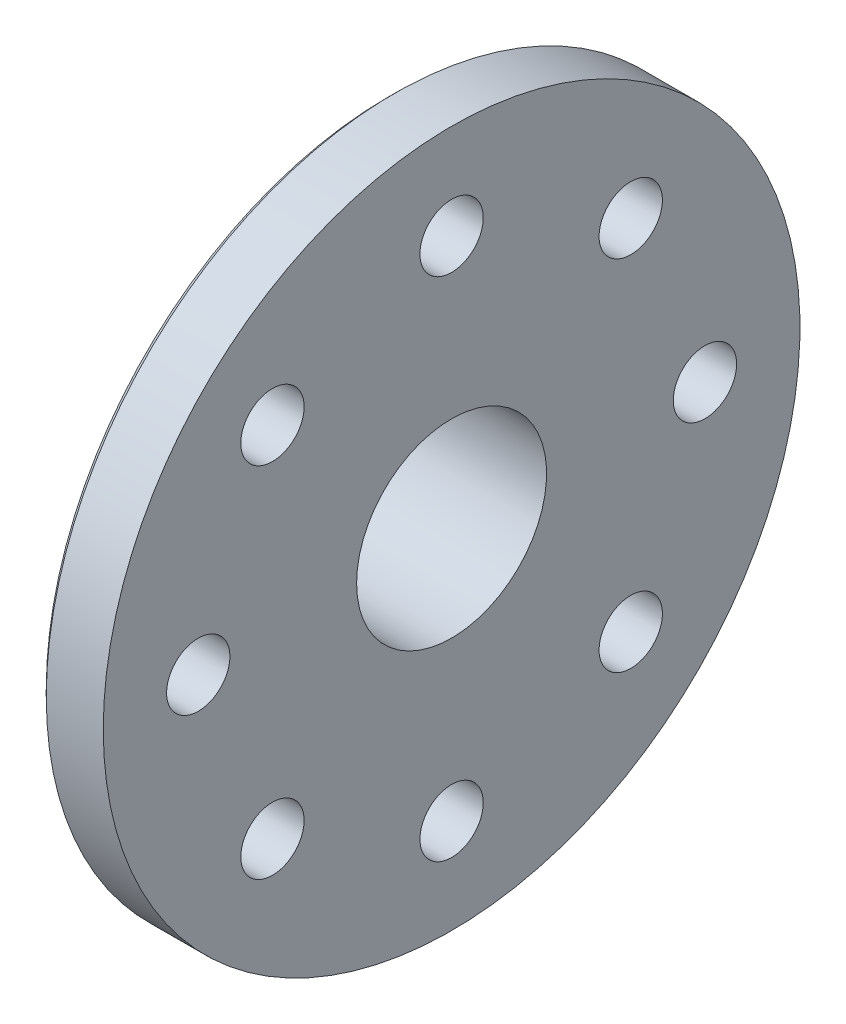
ISO-10303-21;
HEADER;
FILE_DESCRIPTION(('STEP AP214'),'2;1');
FILE_NAME('part.step','',(''),(''),'','','');
FILE_SCHEMA(('AUTOMOTIVE_DESIGN { 1 0 10303 214 1 1 1 1 }'));
ENDSEC;
DATA;
#1=APPLICATION_CONTEXT('core data for automotive mechanical design processes');
#2=APPLICATION_PROTOCOL_DEFINITION('international standard','automotive_design',2000,#1);
#3=PRODUCT_CONTEXT('',#1,'mechanical');
#4=PRODUCT('Part','Part','',(#3));
#5=PRODUCT_RELATED_PRODUCT_CATEGORY('part','',(#4));
#6=PRODUCT_DEFINITION_FORMATION('','',#4);
#7=PRODUCT_DEFINITION_CONTEXT('part definition',#1,'design');
#8=PRODUCT_DEFINITION('design','',#6,#7);
#9=PRODUCT_DEFINITION_SHAPE('','',#8);
#10=(LENGTH_UNIT() NAMED_UNIT(*) SI_UNIT(.MILLI.,.METRE.));
#11=(NAMED_UNIT(*) PLANE_ANGLE_UNIT() SI_UNIT($,.RADIAN.));
#12=(NAMED_UNIT(*) SI_UNIT($,.STERADIAN.) SOLID_ANGLE_UNIT());
#13=UNCERTAINTY_MEASURE_WITH_UNIT(LENGTH_MEASURE(1.E-05),#10,'distance_accuracy_value','');
#14=(GEOMETRIC_REPRESENTATION_CONTEXT(3) GLOBAL_UNCERTAINTY_ASSIGNED_CONTEXT((#13)) GLOBAL_UNIT_ASSIGNED_CONTEXT((#10,
#11,#12)) REPRESENTATION_CONTEXT('',''));
#15=CARTESIAN_POINT('',(0.,0.,0.));
#16=DIRECTION('',(0.,0.,1.));
#17=DIRECTION('',(1.,0.,0.));
#18=AXIS2_PLACEMENT_3D('',#15,#16,#17);
#19=CARTESIAN_POINT('',(1.,3.,0.));
#20=DIRECTION('',(-1.,0.,0.));
#21=DIRECTION('',(0.,0.,1.));
#22=AXIS2_PLACEMENT_3D('',#19,#20,#21);
#23=PLANE('',#22);
#24=CARTESIAN_POINT('',(1.,5.65685424949245,5.65685424949231));
#25=DIRECTION('',(-1.,0.,0.));
#26=DIRECTION('',(0.,-0.707106781186539,0.707106781186556));
#27=AXIS2_PLACEMENT_3D('',#24,#25,#26);
#28=CIRCLE('',#27,1.);
#29=CARTESIAN_POINT('',(1.,4.94974746830591,6.36396103067887));
#30=VERTEX_POINT('',#29);
#31=EDGE_CURVE('E137',#30,#30,#28,.T.);
#32=ORIENTED_EDGE('',*,*,#31,.T.);
#33=EDGE_LOOP('',(#32));
#34=FACE_BOUND('',#33,.T.);
#35=CARTESIAN_POINT('',(1.,0.,8.));
#36=DIRECTION('',(-1.,0.,0.));
#37=DIRECTION('',(0.,-1.,0.));
#38=AXIS2_PLACEMENT_3D('',#35,#36,#37);
#39=CIRCLE('',#38,1.);
#40=CARTESIAN_POINT('',(1.,-0.999999999999917,8.00000000000001));
#41=VERTEX_POINT('',#40);
#42=EDGE_CURVE('E134',#41,#41,#39,.T.);
#43=ORIENTED_EDGE('',*,*,#42,.T.);
#44=EDGE_LOOP('',(#43));
#45=FACE_BOUND('',#44,.T.);
#46=CARTESIAN_POINT('',(1.,-5.65685424949233,5.65685424949243));
#47=DIRECTION('',(-1.,0.,0.));
#48=DIRECTION('',(0.,-0.707106781186554,-0.707106781186541));
#49=AXIS2_PLACEMENT_3D('',#46,#47,#48);
#50=CIRCLE('',#49,1.);
#51=CARTESIAN_POINT('',(1.,-6.36396103067888,4.94974746830589));
#52=VERTEX_POINT('',#51);
#53=EDGE_CURVE('E131',#52,#52,#50,.T.);
#54=ORIENTED_EDGE('',*,*,#53,.T.);
#55=EDGE_LOOP('',(#54));
#56=FACE_BOUND('',#55,.T.);
#57=CARTESIAN_POINT('',(1.,-8.,0.));
#58=DIRECTION('',(-1.,0.,0.));
#59=DIRECTION('',(0.,0.,-1.));
#60=AXIS2_PLACEMENT_3D('',#57,#58,#59);
#61=CIRCLE('',#60,1.);
#62=CARTESIAN_POINT('',(1.,-8.,-1.));
#63=VERTEX_POINT('',#62);
#64=EDGE_CURVE('E128',#63,#63,#61,.T.);
#65=ORIENTED_EDGE('',*,*,#64,.T.);
#66=EDGE_LOOP('',(#65));
#67=FACE_BOUND('',#66,.T.);
#68=CARTESIAN_POINT('',(1.,-5.65685424949241,-5.65685424949235));
#69=DIRECTION('',(-1.,0.,0.));
#70=DIRECTION('',(0.,0.707106781186544,-0.707106781186551));
#71=AXIS2_PLACEMENT_3D('',#68,#69,#70);
#72=CIRCLE('',#71,1.);
#73=CARTESIAN_POINT('',(1.,-4.94974746830587,-6.3639610306789));
#74=VERTEX_POINT('',#73);
#75=EDGE_CURVE('E125',#74,#74,#72,.T.);
#76=ORIENTED_EDGE('',*,*,#75,.T.);
#77=EDGE_LOOP('',(#76));
#78=FACE_BOUND('',#77,.T.);
#79=CARTESIAN_POINT('',(1.,0.,-8.));
#80=DIRECTION('',(-1.,0.,0.));
#81=DIRECTION('',(0.,1.,0.));
#82=AXIS2_PLACEMENT_3D('',#79,#80,#81);
#83=CIRCLE('',#82,1.);
#84=CARTESIAN_POINT('',(1.,0.999999999999972,-8.));
#85=VERTEX_POINT('',#84);
#86=EDGE_CURVE('E122',#85,#85,#83,.T.);
#87=ORIENTED_EDGE('',*,*,#86,.T.);
#88=EDGE_LOOP('',(#87));
#89=FACE_BOUND('',#88,.T.);
#90=CARTESIAN_POINT('',(1.,5.65685424949237,-5.65685424949239));
#91=DIRECTION('',(-1.,0.,0.));
#92=DIRECTION('',(0.,0.707106781186549,0.707106781186546));
#93=AXIS2_PLACEMENT_3D('',#90,#91,#92);
#94=CIRCLE('',#93,1.);
#95=CARTESIAN_POINT('',(1.,6.36396103067892,-4.94974746830584));
#96=VERTEX_POINT('',#95);
#97=EDGE_CURVE('E119',#96,#96,#94,.T.);
#98=ORIENTED_EDGE('',*,*,#97,.T.);
#99=EDGE_LOOP('',(#98));
#100=FACE_BOUND('',#99,.T.);
#101=CARTESIAN_POINT('',(1.,8.,0.));
#102=DIRECTION('',(-1.,0.,0.));
#103=DIRECTION('',(0.,0.,1.));
#104=AXIS2_PLACEMENT_3D('',#101,#102,#103);
#105=CIRCLE('',#104,1.);
#106=CARTESIAN_POINT('',(1.,8.,1.));
#107=VERTEX_POINT('',#106);
#108=EDGE_CURVE('E116',#107,#107,#105,.T.);
#109=ORIENTED_EDGE('',*,*,#108,.T.);
#110=EDGE_LOOP('',(#109));
#111=FACE_BOUND('',#110,.T.);
#112=CARTESIAN_POINT('',(1.,0.,0.));
#113=DIRECTION('',(-1.,0.,0.));
#114=DIRECTION('',(0.,0.,1.));
#115=AXIS2_PLACEMENT_3D('',#112,#113,#114);
#116=CIRCLE('',#115,11.);
#117=CARTESIAN_POINT('',(1.,0.,11.));
#118=VERTEX_POINT('',#117);
#119=EDGE_CURVE('E98',#118,#118,#116,.T.);
#120=ORIENTED_EDGE('',*,*,#119,.F.);
#121=EDGE_LOOP('',(#120));
#122=FACE_BOUND('',#121,.T.);
#123=CARTESIAN_POINT('',(1.,0.,0.));
#124=DIRECTION('',(-1.,0.,0.));
#125=DIRECTION('',(0.,0.,1.));
#126=AXIS2_PLACEMENT_3D('',#123,#124,#125);
#127=CIRCLE('',#126,3.);
#128=CARTESIAN_POINT('',(1.,0.,3.));
#129=VERTEX_POINT('',#128);
#130=EDGE_CURVE('E113',#129,#129,#127,.T.);
#131=ORIENTED_EDGE('',*,*,#130,.T.);
#132=EDGE_LOOP('',(#131));
#133=FACE_BOUND('',#132,.T.);
#134=ADVANCED_FACE('F30',(#34,#45,#56,#67,#78,#89,#100,#111,#122,#133),#23,.F.);
#135=CARTESIAN_POINT('',(0.,0.,0.));
#136=DIRECTION('',(-1.,0.,0.));
#137=DIRECTION('',(0.,0.,1.));
#138=AXIS2_PLACEMENT_3D('',#135,#136,#137);
#139=CYLINDRICAL_SURFACE('',#138,11.);
#140=CARTESIAN_POINT('',(-0.800000000000007,0.,0.));
#141=DIRECTION('',(1.,0.,0.));
#142=DIRECTION('',(0.,0.,-1.));
#143=AXIS2_PLACEMENT_3D('',#140,#141,#142);
#144=CIRCLE('',#143,11.);
#145=CARTESIAN_POINT('',(-0.800000000000007,0.,-11.));
#146=VERTEX_POINT('',#145);
#147=EDGE_CURVE('E56',#146,#146,#144,.T.);
#148=ORIENTED_EDGE('',*,*,#147,.T.);
#149=EDGE_LOOP('',(#148));
#150=FACE_BOUND('',#149,.T.);
#151=ORIENTED_EDGE('',*,*,#119,.T.);
#152=EDGE_LOOP('',(#151));
#153=FACE_BOUND('',#152,.T.);
#154=ADVANCED_FACE('F160',(#150,#153),#139,.T.);
#155=CARTESIAN_POINT('',(-0.999999999999999,11.,0.));
#156=DIRECTION('',(1.,0.,0.));
#157=DIRECTION('',(0.,0.,-1.));
#158=AXIS2_PLACEMENT_3D('',#155,#156,#157);
#159=PLANE('',#158);
#160=CARTESIAN_POINT('',(-0.999999999999999,-5.65685424949233,5.65685424949243));
#161=DIRECTION('',(1.,0.,0.));
#162=DIRECTION('',(0.,0.,-1.));
#163=AXIS2_PLACEMENT_3D('',#160,#161,#162);
#164=CIRCLE('',#163,1.2);
#165=CARTESIAN_POINT('',(-0.999999999999999,-5.65685424949233,4.45685424949243));
#166=VERTEX_POINT('',#165);
#167=EDGE_CURVE('E68',#166,#166,#164,.T.);
#168=ORIENTED_EDGE('',*,*,#167,.T.);
#169=EDGE_LOOP('',(#168));
#170=FACE_BOUND('',#169,.T.);
#171=CARTESIAN_POINT('',(-0.999999999999999,0.,8.));
#172=DIRECTION('',(1.,0.,0.));
#173=DIRECTION('',(0.,0.,-1.));
#174=AXIS2_PLACEMENT_3D('',#171,#172,#173);
#175=CIRCLE('',#174,1.2);
#176=CARTESIAN_POINT('',(-0.999999999999999,0.,6.8));
#177=VERTEX_POINT('',#176);
#178=EDGE_CURVE('E71',#177,#177,#175,.T.);
#179=ORIENTED_EDGE('',*,*,#178,.T.);
#180=EDGE_LOOP('',(#179));
#181=FACE_BOUND('',#180,.T.);
#182=CARTESIAN_POINT('',(-0.999999999999999,5.65685424949245,5.65685424949231));
#183=DIRECTION('',(1.,0.,0.));
#184=DIRECTION('',(0.,0.,-1.));
#185=AXIS2_PLACEMENT_3D('',#182,#183,#184);
#186=CIRCLE('',#185,1.2);
#187=CARTESIAN_POINT('',(-0.999999999999999,5.65685424949245,4.45685424949231));
#188=VERTEX_POINT('',#187);
#189=EDGE_CURVE('E74',#188,#188,#186,.T.);
#190=ORIENTED_EDGE('',*,*,#189,.T.);
#191=EDGE_LOOP('',(#190));
#192=FACE_BOUND('',#191,.T.);
#193=CARTESIAN_POINT('',(-0.999999999999999,8.,0.));
#194=DIRECTION('',(1.,0.,0.));
#195=DIRECTION('',(0.,0.,-1.));
#196=AXIS2_PLACEMENT_3D('',#193,#194,#195);
#197=CIRCLE('',#196,1.2);
#198=CARTESIAN_POINT('',(-0.999999999999999,8.,-1.2));
#199=VERTEX_POINT('',#198);
#200=EDGE_CURVE('E77',#199,#199,#197,.T.);
#201=ORIENTED_EDGE('',*,*,#200,.T.);
#202=EDGE_LOOP('',(#201));
#203=FACE_BOUND('',#202,.T.);
#204=CARTESIAN_POINT('',(-0.999999999999999,0.,0.));
#205=DIRECTION('',(1.,0.,0.));
#206=DIRECTION('',(0.,0.,-1.));
#207=AXIS2_PLACEMENT_3D('',#204,#205,#206);
#208=CIRCLE('',#207,10.8);
#209=CARTESIAN_POINT('',(-0.999999999999999,0.,-10.8));
#210=VERTEX_POINT('',#209);
#211=EDGE_CURVE('E80',#210,#210,#208,.F.);
#212=ORIENTED_EDGE('',*,*,#211,.T.);
#213=EDGE_LOOP('',(#212));
#214=FACE_BOUND('',#213,.T.);
#215=CARTESIAN_POINT('',(-0.999999999999999,-8.,0.));
#216=DIRECTION('',(1.,0.,0.));
#217=DIRECTION('',(0.,0.,-1.));
#218=AXIS2_PLACEMENT_3D('',#215,#216,#217);
#219=CIRCLE('',#218,1.2);
#220=CARTESIAN_POINT('',(-0.999999999999999,-8.,-1.2));
#221=VERTEX_POINT('',#220);
#222=EDGE_CURVE('E83',#221,#221,#219,.T.);
#223=ORIENTED_EDGE('',*,*,#222,.T.);
#224=EDGE_LOOP('',(#223));
#225=FACE_BOUND('',#224,.T.);
#226=CARTESIAN_POINT('',(-0.999999999999999,-5.65685424949241,-5.65685424949235));
#227=DIRECTION('',(1.,0.,0.));
#228=DIRECTION('',(0.,0.,-1.));
#229=AXIS2_PLACEMENT_3D('',#226,#227,#228);
#230=CIRCLE('',#229,1.2);
#231=CARTESIAN_POINT('',(-0.999999999999999,-5.65685424949241,-6.85685424949235));
#232=VERTEX_POINT('',#231);
#233=EDGE_CURVE('E86',#232,#232,#230,.T.);
#234=ORIENTED_EDGE('',*,*,#233,.T.);
#235=EDGE_LOOP('',(#234));
#236=FACE_BOUND('',#235,.T.);
#237=CARTESIAN_POINT('',(-0.999999999999999,0.,-8.));
#238=DIRECTION('',(1.,0.,0.));
#239=DIRECTION('',(0.,0.,-1.));
#240=AXIS2_PLACEMENT_3D('',#237,#238,#239);
#241=CIRCLE('',#240,1.2);
#242=CARTESIAN_POINT('',(-0.999999999999999,0.,-9.2));
#243=VERTEX_POINT('',#242);
#244=EDGE_CURVE('E89',#243,#243,#241,.T.);
#245=ORIENTED_EDGE('',*,*,#244,.T.);
#246=EDGE_LOOP('',(#245));
#247=FACE_BOUND('',#246,.T.);
#248=CARTESIAN_POINT('',(-0.999999999999999,5.65685424949237,-5.65685424949239));
#249=DIRECTION('',(1.,0.,0.));
#250=DIRECTION('',(0.,0.,-1.));
#251=AXIS2_PLACEMENT_3D('',#248,#249,#250);
#252=CIRCLE('',#251,1.2);
#253=CARTESIAN_POINT('',(-0.999999999999999,5.65685424949237,-6.85685424949239));
#254=VERTEX_POINT('',#253);
#255=EDGE_CURVE('E92',#254,#254,#252,.T.);
#256=ORIENTED_EDGE('',*,*,#255,.T.);
#257=EDGE_LOOP('',(#256));
#258=FACE_BOUND('',#257,.T.);
#259=CARTESIAN_POINT('',(-0.999999999999999,0.,0.));
#260=DIRECTION('',(-1.,0.,0.));
#261=DIRECTION('',(0.,0.,1.));
#262=AXIS2_PLACEMENT_3D('',#259,#260,#261);
#263=CIRCLE('',#262,3.75);
#264=CARTESIAN_POINT('',(-0.999999999999999,0.,3.75));
#265=VERTEX_POINT('',#264);
#266=EDGE_CURVE('E101',#265,#265,#263,.T.);
#267=ORIENTED_EDGE('',*,*,#266,.F.);
#268=EDGE_LOOP('',(#267));
#269=FACE_BOUND('',#268,.T.);
#270=ADVANCED_FACE('F165',(#170,#181,#192,#203,#214,#225,#236,#247,#258,#269),#159,.F.);
#271=CARTESIAN_POINT('',(0.,0.,0.));
#272=DIRECTION('',(-1.,0.,0.));
#273=DIRECTION('',(0.,0.,1.));
#274=AXIS2_PLACEMENT_3D('',#271,#272,#273);
#275=CYLINDRICAL_SURFACE('',#274,3.75);
#276=CARTESIAN_POINT('',(-3.79999999999999,0.,0.));
#277=DIRECTION('',(1.,0.,0.));
#278=DIRECTION('',(0.,0.,-1.));
#279=AXIS2_PLACEMENT_3D('',#276,#277,#278);
#280=CIRCLE('',#279,3.75);
#281=CARTESIAN_POINT('',(-3.79999999999999,0.,-3.75));
#282=VERTEX_POINT('',#281);
#283=EDGE_CURVE('E10',#282,#282,#280,.T.);
#284=ORIENTED_EDGE('',*,*,#283,.T.);
#285=EDGE_LOOP('',(#284));
#286=FACE_BOUND('',#285,.T.);
#287=ORIENTED_EDGE('',*,*,#266,.T.);
#288=EDGE_LOOP('',(#287));
#289=FACE_BOUND('',#288,.T.);
#290=ADVANCED_FACE('F242',(#286,#289),#275,.T.);
#291=CARTESIAN_POINT('',(-4.,3.75,0.));
#292=DIRECTION('',(1.,0.,0.));
#293=DIRECTION('',(0.,0.,-1.));
#294=AXIS2_PLACEMENT_3D('',#291,#292,#293);
#295=PLANE('',#294);
#296=CARTESIAN_POINT('',(-4.,0.,0.));
#297=DIRECTION('',(1.,0.,0.));
#298=DIRECTION('',(0.,0.,-1.));
#299=AXIS2_PLACEMENT_3D('',#296,#297,#298);
#300=CIRCLE('',#299,3.55);
#301=CARTESIAN_POINT('',(-4.,0.,-3.55));
#302=VERTEX_POINT('',#301);
#303=EDGE_CURVE('E37',#302,#302,#300,.F.);
#304=ORIENTED_EDGE('',*,*,#303,.T.);
#305=EDGE_LOOP('',(#304));
#306=FACE_BOUND('',#305,.T.);
#307=CARTESIAN_POINT('',(-4.,0.,0.));
#308=DIRECTION('',(-1.,0.,0.));
#309=DIRECTION('',(0.,0.,1.));
#310=AXIS2_PLACEMENT_3D('',#307,#308,#309);
#311=CIRCLE('',#310,1.5);
#312=CARTESIAN_POINT('',(-4.,0.,1.5));
#313=VERTEX_POINT('',#312);
#314=EDGE_CURVE('E104',#313,#313,#311,.T.);
#315=ORIENTED_EDGE('',*,*,#314,.F.);
#316=EDGE_LOOP('',(#315));
#317=FACE_BOUND('',#316,.T.);
#318=ADVANCED_FACE('F237',(#306,#317),#295,.F.);
#319=CARTESIAN_POINT('',(0.,0.,0.));
#320=DIRECTION('',(-1.,0.,0.));
#321=DIRECTION('',(0.,0.,1.));
#322=AXIS2_PLACEMENT_3D('',#319,#320,#321);
#323=CYLINDRICAL_SURFACE('',#322,1.5);
#324=CARTESIAN_POINT('',(-3.5,0.,0.));
#325=DIRECTION('',(-1.,0.,0.));
#326=DIRECTION('',(0.,0.,1.));
#327=AXIS2_PLACEMENT_3D('',#324,#325,#326);
#328=CIRCLE('',#327,1.5);
#329=CARTESIAN_POINT('',(-3.5,0.,1.5));
#330=VERTEX_POINT('',#329);
#331=EDGE_CURVE('E107',#330,#330,#328,.T.);
#332=ORIENTED_EDGE('',*,*,#331,.F.);
#333=EDGE_LOOP('',(#332));
#334=FACE_BOUND('',#333,.T.);
#335=ORIENTED_EDGE('',*,*,#314,.T.);
#336=EDGE_LOOP('',(#335));
#337=FACE_BOUND('',#336,.T.);
#338=ADVANCED_FACE('F231',(#334,#337),#323,.F.);
#339=CARTESIAN_POINT('',(-3.5,3.,0.));
#340=DIRECTION('',(-1.,0.,0.));
#341=DIRECTION('',(0.,0.,1.));
#342=AXIS2_PLACEMENT_3D('',#339,#340,#341);
#343=PLANE('',#342);
#344=CARTESIAN_POINT('',(-3.5,0.,0.));
#345=DIRECTION('',(-1.,0.,0.));
#346=DIRECTION('',(0.,0.,1.));
#347=AXIS2_PLACEMENT_3D('',#344,#345,#346);
#348=CIRCLE('',#347,3.);
#349=CARTESIAN_POINT('',(-3.5,0.,3.));
#350=VERTEX_POINT('',#349);
#351=EDGE_CURVE('E110',#350,#350,#348,.T.);
#352=ORIENTED_EDGE('',*,*,#351,.F.);
#353=EDGE_LOOP('',(#352));
#354=FACE_BOUND('',#353,.T.);
#355=ORIENTED_EDGE('',*,*,#331,.T.);
#356=EDGE_LOOP('',(#355));
#357=FACE_BOUND('',#356,.T.);
#358=ADVANCED_FACE('F225',(#354,#357),#343,.F.);
#359=CARTESIAN_POINT('',(0.,0.,0.));
#360=DIRECTION('',(-1.,0.,0.));
#361=DIRECTION('',(0.,0.,1.));
#362=AXIS2_PLACEMENT_3D('',#359,#360,#361);
#363=CYLINDRICAL_SURFACE('',#362,3.);
#364=ORIENTED_EDGE('',*,*,#130,.F.);
#365=EDGE_LOOP('',(#364));
#366=FACE_BOUND('',#365,.T.);
#367=ORIENTED_EDGE('',*,*,#351,.T.);
#368=EDGE_LOOP('',(#367));
#369=FACE_BOUND('',#368,.T.);
#370=ADVANCED_FACE('F222',(#366,#369),#363,.F.);
#371=CARTESIAN_POINT('',(1.,8.,0.));
#372=DIRECTION('',(-1.,0.,0.));
#373=DIRECTION('',(0.,0.,1.));
#374=AXIS2_PLACEMENT_3D('',#371,#372,#373);
#375=CYLINDRICAL_SURFACE('',#374,1.);
#376=CARTESIAN_POINT('',(-0.799999999999997,8.,0.));
#377=DIRECTION('',(1.,0.,0.));
#378=DIRECTION('',(0.,0.,-1.));
#379=AXIS2_PLACEMENT_3D('',#376,#377,#378);
#380=CIRCLE('',#379,1.);
#381=CARTESIAN_POINT('',(-0.799999999999997,8.,-1.));
#382=VERTEX_POINT('',#381);
#383=EDGE_CURVE('E59',#382,#382,#380,.F.);
#384=ORIENTED_EDGE('',*,*,#383,.T.);
#385=EDGE_LOOP('',(#384));
#386=FACE_BOUND('',#385,.T.);
#387=ORIENTED_EDGE('',*,*,#108,.F.);
#388=EDGE_LOOP('',(#387));
#389=FACE_BOUND('',#388,.T.);
#390=ADVANCED_FACE('F211',(#386,#389),#375,.F.);
#391=CARTESIAN_POINT('',(1.,5.65685424949237,-5.65685424949239));
#392=DIRECTION('',(-1.,0.,0.));
#393=DIRECTION('',(0.,0.,1.));
#394=AXIS2_PLACEMENT_3D('',#391,#392,#393);
#395=CYLINDRICAL_SURFACE('',#394,1.);
#396=CARTESIAN_POINT('',(-0.799999999999997,5.65685424949237,-5.65685424949239));
#397=DIRECTION('',(1.,0.,0.));
#398=DIRECTION('',(0.,0.,-1.));
#399=AXIS2_PLACEMENT_3D('',#396,#397,#398);
#400=CIRCLE('',#399,1.);
#401=CARTESIAN_POINT('',(-0.799999999999997,5.65685424949237,-6.65685424949239));
#402=VERTEX_POINT('',#401);
#403=EDGE_CURVE('E41',#402,#402,#400,.F.);
#404=ORIENTED_EDGE('',*,*,#403,.T.);
#405=EDGE_LOOP('',(#404));
#406=FACE_BOUND('',#405,.T.);
#407=ORIENTED_EDGE('',*,*,#97,.F.);
#408=EDGE_LOOP('',(#407));
#409=FACE_BOUND('',#408,.T.);
#410=ADVANCED_FACE('F207',(#406,#409),#395,.F.);
#411=CARTESIAN_POINT('',(1.,0.,-8.));
#412=DIRECTION('',(-1.,0.,0.));
#413=DIRECTION('',(0.,0.,1.));
#414=AXIS2_PLACEMENT_3D('',#411,#412,#413);
#415=CYLINDRICAL_SURFACE('',#414,1.);
#416=CARTESIAN_POINT('',(-0.799999999999997,0.,-8.));
#417=DIRECTION('',(1.,0.,0.));
#418=DIRECTION('',(0.,0.,-1.));
#419=AXIS2_PLACEMENT_3D('',#416,#417,#418);
#420=CIRCLE('',#419,1.);
#421=CARTESIAN_POINT('',(-0.799999999999997,0.,-9.));
#422=VERTEX_POINT('',#421);
#423=EDGE_CURVE('E45',#422,#422,#420,.F.);
#424=ORIENTED_EDGE('',*,*,#423,.T.);
#425=EDGE_LOOP('',(#424));
#426=FACE_BOUND('',#425,.T.);
#427=ORIENTED_EDGE('',*,*,#86,.F.);
#428=EDGE_LOOP('',(#427));
#429=FACE_BOUND('',#428,.T.);
#430=ADVANCED_FACE('F210',(#426,#429),#415,.F.);
#431=CARTESIAN_POINT('',(1.,-5.65685424949241,-5.65685424949235));
#432=DIRECTION('',(-1.,0.,0.));
#433=DIRECTION('',(0.,0.,1.));
#434=AXIS2_PLACEMENT_3D('',#431,#432,#433);
#435=CYLINDRICAL_SURFACE('',#434,1.);
#436=CARTESIAN_POINT('',(-0.800000000000001,-5.65685424949241,-5.65685424949235));
#437=DIRECTION('',(1.,0.,0.));
#438=DIRECTION('',(0.,0.,-1.));
#439=AXIS2_PLACEMENT_3D('',#436,#437,#438);
#440=CIRCLE('',#439,1.);
#441=CARTESIAN_POINT('',(-0.800000000000001,-5.65685424949241,-6.65685424949235));
#442=VERTEX_POINT('',#441);
#443=EDGE_CURVE('E50',#442,#442,#440,.F.);
#444=ORIENTED_EDGE('',*,*,#443,.T.);
#445=EDGE_LOOP('',(#444));
#446=FACE_BOUND('',#445,.T.);
#447=ORIENTED_EDGE('',*,*,#75,.F.);
#448=EDGE_LOOP('',(#447));
#449=FACE_BOUND('',#448,.T.);
#450=ADVANCED_FACE('F276',(#446,#449),#435,.F.);
#451=CARTESIAN_POINT('',(1.,-8.,0.));
#452=DIRECTION('',(-1.,0.,0.));
#453=DIRECTION('',(0.,0.,1.));
#454=AXIS2_PLACEMENT_3D('',#451,#452,#453);
#455=CYLINDRICAL_SURFACE('',#454,1.);
#456=CARTESIAN_POINT('',(-0.799999999999997,-8.,0.));
#457=DIRECTION('',(1.,0.,0.));
#458=DIRECTION('',(0.,0.,-1.));
#459=AXIS2_PLACEMENT_3D('',#456,#457,#458);
#460=CIRCLE('',#459,1.);
#461=CARTESIAN_POINT('',(-0.799999999999997,-8.,-1.));
#462=VERTEX_POINT('',#461);
#463=EDGE_CURVE('E53',#462,#462,#460,.F.);
#464=ORIENTED_EDGE('',*,*,#463,.T.);
#465=EDGE_LOOP('',(#464));
#466=FACE_BOUND('',#465,.T.);
#467=ORIENTED_EDGE('',*,*,#64,.F.);
#468=EDGE_LOOP('',(#467));
#469=FACE_BOUND('',#468,.T.);
#470=ADVANCED_FACE('F283',(#466,#469),#455,.F.);
#471=CARTESIAN_POINT('',(1.,-5.65685424949233,5.65685424949243));
#472=DIRECTION('',(-1.,0.,0.));
#473=DIRECTION('',(0.,0.,1.));
#474=AXIS2_PLACEMENT_3D('',#471,#472,#473);
#475=CYLINDRICAL_SURFACE('',#474,1.);
#476=CARTESIAN_POINT('',(-0.799999999999997,-5.65685424949233,5.65685424949243));
#477=DIRECTION('',(1.,0.,0.));
#478=DIRECTION('',(0.,0.,-1.));
#479=AXIS2_PLACEMENT_3D('',#476,#477,#478);
#480=CIRCLE('',#479,1.);
#481=CARTESIAN_POINT('',(-0.799999999999997,-5.65685424949233,4.65685424949243));
#482=VERTEX_POINT('',#481);
#483=EDGE_CURVE('E95',#482,#482,#480,.F.);
#484=ORIENTED_EDGE('',*,*,#483,.T.);
#485=EDGE_LOOP('',(#484));
#486=FACE_BOUND('',#485,.T.);
#487=ORIENTED_EDGE('',*,*,#53,.F.);
#488=EDGE_LOOP('',(#487));
#489=FACE_BOUND('',#488,.T.);
#490=ADVANCED_FACE('F156',(#486,#489),#475,.F.);
#491=CARTESIAN_POINT('',(1.,0.,8.));
#492=DIRECTION('',(-1.,0.,0.));
#493=DIRECTION('',(0.,0.,1.));
#494=AXIS2_PLACEMENT_3D('',#491,#492,#493);
#495=CYLINDRICAL_SURFACE('',#494,1.);
#496=CARTESIAN_POINT('',(-0.799999999999997,0.,8.));
#497=DIRECTION('',(1.,0.,0.));
#498=DIRECTION('',(0.,0.,-1.));
#499=AXIS2_PLACEMENT_3D('',#496,#497,#498);
#500=CIRCLE('',#499,1.);
#501=CARTESIAN_POINT('',(-0.799999999999997,0.,7.));
#502=VERTEX_POINT('',#501);
#503=EDGE_CURVE('E65',#502,#502,#500,.F.);
#504=ORIENTED_EDGE('',*,*,#503,.T.);
#505=EDGE_LOOP('',(#504));
#506=FACE_BOUND('',#505,.T.);
#507=ORIENTED_EDGE('',*,*,#42,.F.);
#508=EDGE_LOOP('',(#507));
#509=FACE_BOUND('',#508,.T.);
#510=ADVANCED_FACE('F146',(#506,#509),#495,.F.);
#511=CARTESIAN_POINT('',(1.,5.65685424949245,5.65685424949231));
#512=DIRECTION('',(-1.,0.,0.));
#513=DIRECTION('',(0.,0.,1.));
#514=AXIS2_PLACEMENT_3D('',#511,#512,#513);
#515=CYLINDRICAL_SURFACE('',#514,1.);
#516=CARTESIAN_POINT('',(-0.800000000000001,5.65685424949245,5.65685424949231));
#517=DIRECTION('',(1.,0.,0.));
#518=DIRECTION('',(0.,0.,-1.));
#519=AXIS2_PLACEMENT_3D('',#516,#517,#518);
#520=CIRCLE('',#519,1.);
#521=CARTESIAN_POINT('',(-0.800000000000001,5.65685424949245,4.65685424949231));
#522=VERTEX_POINT('',#521);
#523=EDGE_CURVE('E62',#522,#522,#520,.F.);
#524=ORIENTED_EDGE('',*,*,#523,.T.);
#525=EDGE_LOOP('',(#524));
#526=FACE_BOUND('',#525,.T.);
#527=ORIENTED_EDGE('',*,*,#31,.F.);
#528=EDGE_LOOP('',(#527));
#529=FACE_BOUND('',#528,.T.);
#530=ADVANCED_FACE('F143',(#526,#529),#515,.F.);
#531=CARTESIAN_POINT('',(-0.799999999999997,-5.65685424949233,5.65685424949243));
#532=DIRECTION('',(-1.,0.,0.));
#533=DIRECTION('',(0.,0.,1.));
#534=AXIS2_PLACEMENT_3D('',#531,#532,#533);
#535=CONICAL_SURFACE('',#534,1.,0.78539816339745);
#536=ORIENTED_EDGE('',*,*,#167,.F.);
#537=EDGE_LOOP('',(#536));
#538=FACE_BOUND('',#537,.T.);
#539=ORIENTED_EDGE('',*,*,#483,.F.);
#540=EDGE_LOOP('',(#539));
#541=FACE_BOUND('',#540,.T.);
#542=ADVANCED_FACE('F145',(#538,#541),#535,.F.);
#543=CARTESIAN_POINT('',(-0.799999999999997,0.,8.));
#544=DIRECTION('',(-1.,0.,0.));
#545=DIRECTION('',(0.,0.,1.));
#546=AXIS2_PLACEMENT_3D('',#543,#544,#545);
#547=CONICAL_SURFACE('',#546,1.,0.785398163397449);
#548=ORIENTED_EDGE('',*,*,#178,.F.);
#549=EDGE_LOOP('',(#548));
#550=FACE_BOUND('',#549,.T.);
#551=ORIENTED_EDGE('',*,*,#503,.F.);
#552=EDGE_LOOP('',(#551));
#553=FACE_BOUND('',#552,.T.);
#554=ADVANCED_FACE('F153',(#550,#553),#547,.F.);
#555=CARTESIAN_POINT('',(-0.800000000000001,5.65685424949245,5.65685424949231));
#556=DIRECTION('',(-1.,0.,0.));
#557=DIRECTION('',(0.,0.,1.));
#558=AXIS2_PLACEMENT_3D('',#555,#556,#557);
#559=CONICAL_SURFACE('',#558,1.,0.785398163397443);
#560=ORIENTED_EDGE('',*,*,#189,.F.);
#561=EDGE_LOOP('',(#560));
#562=FACE_BOUND('',#561,.T.);
#563=ORIENTED_EDGE('',*,*,#523,.F.);
#564=EDGE_LOOP('',(#563));
#565=FACE_BOUND('',#564,.T.);
#566=ADVANCED_FACE('F172',(#562,#565),#559,.F.);
#567=CARTESIAN_POINT('',(-0.799999999999997,8.,0.));
#568=DIRECTION('',(-1.,0.,0.));
#569=DIRECTION('',(0.,0.,1.));
#570=AXIS2_PLACEMENT_3D('',#567,#568,#569);
#571=CONICAL_SURFACE('',#570,1.,0.785398163397449);
#572=ORIENTED_EDGE('',*,*,#200,.F.);
#573=EDGE_LOOP('',(#572));
#574=FACE_BOUND('',#573,.T.);
#575=ORIENTED_EDGE('',*,*,#383,.F.);
#576=EDGE_LOOP('',(#575));
#577=FACE_BOUND('',#576,.T.);
#578=ADVANCED_FACE('F176',(#574,#577),#571,.F.);
#579=CARTESIAN_POINT('',(-0.999999999999999,0.,0.));
#580=DIRECTION('',(1.,0.,0.));
#581=DIRECTION('',(0.,0.,-1.));
#582=AXIS2_PLACEMENT_3D('',#579,#580,#581);
#583=CONICAL_SURFACE('',#582,10.8,0.785398163397457);
#584=ORIENTED_EDGE('',*,*,#147,.F.);
#585=EDGE_LOOP('',(#584));
#586=FACE_BOUND('',#585,.T.);
#587=ORIENTED_EDGE('',*,*,#211,.F.);
#588=EDGE_LOOP('',(#587));
#589=FACE_BOUND('',#588,.T.);
#590=ADVANCED_FACE('F180',(#586,#589),#583,.T.);
#591=CARTESIAN_POINT('',(-0.799999999999997,-8.,0.));
#592=DIRECTION('',(-1.,0.,0.));
#593=DIRECTION('',(0.,0.,1.));
#594=AXIS2_PLACEMENT_3D('',#591,#592,#593);
#595=CONICAL_SURFACE('',#594,1.,0.785398163397449);
#596=ORIENTED_EDGE('',*,*,#222,.F.);
#597=EDGE_LOOP('',(#596));
#598=FACE_BOUND('',#597,.T.);
#599=ORIENTED_EDGE('',*,*,#463,.F.);
#600=EDGE_LOOP('',(#599));
#601=FACE_BOUND('',#600,.T.);
#602=ADVANCED_FACE('F184',(#598,#601),#595,.F.);
#603=CARTESIAN_POINT('',(-0.800000000000001,-5.65685424949241,-5.65685424949235));
#604=DIRECTION('',(-1.,0.,0.));
#605=DIRECTION('',(0.,0.,1.));
#606=AXIS2_PLACEMENT_3D('',#603,#604,#605);
#607=CONICAL_SURFACE('',#606,1.,0.785398163397448);
#608=ORIENTED_EDGE('',*,*,#233,.F.);
#609=EDGE_LOOP('',(#608));
#610=FACE_BOUND('',#609,.T.);
#611=ORIENTED_EDGE('',*,*,#443,.F.);
#612=EDGE_LOOP('',(#611));
#613=FACE_BOUND('',#612,.T.);
#614=ADVANCED_FACE('F188',(#610,#613),#607,.F.);
#615=CARTESIAN_POINT('',(-0.799999999999997,0.,-8.));
#616=DIRECTION('',(-1.,0.,0.));
#617=DIRECTION('',(0.,0.,1.));
#618=AXIS2_PLACEMENT_3D('',#615,#616,#617);
#619=CONICAL_SURFACE('',#618,1.,0.785398163397449);
#620=ORIENTED_EDGE('',*,*,#244,.F.);
#621=EDGE_LOOP('',(#620));
#622=FACE_BOUND('',#621,.T.);
#623=ORIENTED_EDGE('',*,*,#423,.F.);
#624=EDGE_LOOP('',(#623));
#625=FACE_BOUND('',#624,.T.);
#626=ADVANCED_FACE('F192',(#622,#625),#619,.F.);
#627=CARTESIAN_POINT('',(-0.799999999999997,5.65685424949237,-5.65685424949239));
#628=DIRECTION('',(-1.,0.,0.));
#629=DIRECTION('',(0.,0.,1.));
#630=AXIS2_PLACEMENT_3D('',#627,#628,#629);
#631=CONICAL_SURFACE('',#630,1.,0.785398163397452);
#632=ORIENTED_EDGE('',*,*,#255,.F.);
#633=EDGE_LOOP('',(#632));
#634=FACE_BOUND('',#633,.T.);
#635=ORIENTED_EDGE('',*,*,#403,.F.);
#636=EDGE_LOOP('',(#635));
#637=FACE_BOUND('',#636,.T.);
#638=ADVANCED_FACE('F195',(#634,#637),#631,.F.);
#639=CARTESIAN_POINT('',(-4.,0.,0.));
#640=DIRECTION('',(1.,0.,0.));
#641=DIRECTION('',(0.,0.,-1.));
#642=AXIS2_PLACEMENT_3D('',#639,#640,#641);
#643=CONICAL_SURFACE('',#642,3.55,0.785398163397442);
#644=CARTESIAN_POINT('',(-3.79999999999999,0.,-3.75));
#645=CARTESIAN_POINT('',(-3.80208333333333,0.,-3.74791666666667));
#646=CARTESIAN_POINT('',(-3.80416666666666,0.,-3.74583333333333));
#647=CARTESIAN_POINT('',(-3.80833333333333,0.,-3.74166666666667));
#648=CARTESIAN_POINT('',(-3.81041666666666,0.,-3.73958333333333));
#649=CARTESIAN_POINT('',(-3.81458333333333,0.,-3.73541666666667));
#650=CARTESIAN_POINT('',(-3.81666666666666,0.,-3.73333333333333));
#651=CARTESIAN_POINT('',(-3.82083333333333,0.,-3.72916666666667));
#652=CARTESIAN_POINT('',(-3.82291666666666,0.,-3.72708333333333));
#653=CARTESIAN_POINT('',(-3.82708333333333,0.,-3.72291666666667));
#654=CARTESIAN_POINT('',(-3.82916666666666,0.,-3.72083333333333));
#655=CARTESIAN_POINT('',(-3.83333333333333,0.,-3.71666666666667));
#656=CARTESIAN_POINT('',(-3.83541666666666,0.,-3.71458333333333));
#657=CARTESIAN_POINT('',(-3.83958333333333,0.,-3.71041666666667));
#658=CARTESIAN_POINT('',(-3.84166666666666,0.,-3.70833333333333));
#659=CARTESIAN_POINT('',(-3.84583333333333,0.,-3.70416666666667));
#660=CARTESIAN_POINT('',(-3.84791666666666,0.,-3.70208333333333));
#661=CARTESIAN_POINT('',(-3.85208333333333,0.,-3.69791666666667));
#662=CARTESIAN_POINT('',(-3.85416666666666,0.,-3.69583333333333));
#663=CARTESIAN_POINT('',(-3.85833333333333,0.,-3.69166666666667));
#664=CARTESIAN_POINT('',(-3.86041666666666,0.,-3.68958333333333));
#665=CARTESIAN_POINT('',(-3.86458333333333,0.,-3.68541666666667));
#666=CARTESIAN_POINT('',(-3.86666666666666,0.,-3.68333333333333));
#667=CARTESIAN_POINT('',(-3.87083333333333,0.,-3.67916666666667));
#668=CARTESIAN_POINT('',(-3.87291666666666,0.,-3.67708333333333));
#669=CARTESIAN_POINT('',(-3.87708333333333,0.,-3.67291666666667));
#670=CARTESIAN_POINT('',(-3.87916666666666,0.,-3.67083333333333));
#671=CARTESIAN_POINT('',(-3.88333333333333,0.,-3.66666666666667));
#672=CARTESIAN_POINT('',(-3.88541666666666,0.,-3.66458333333333));
#673=CARTESIAN_POINT('',(-3.88958333333333,0.,-3.66041666666667));
#674=CARTESIAN_POINT('',(-3.89166666666666,0.,-3.65833333333333));
#675=CARTESIAN_POINT('',(-3.89583333333333,0.,-3.65416666666667));
#676=CARTESIAN_POINT('',(-3.89791666666666,0.,-3.65208333333333));
#677=CARTESIAN_POINT('',(-3.90208333333333,0.,-3.64791666666667));
#678=CARTESIAN_POINT('',(-3.90416666666666,0.,-3.64583333333333));
#679=CARTESIAN_POINT('',(-3.90833333333333,0.,-3.64166666666666));
#680=CARTESIAN_POINT('',(-3.91041666666666,0.,-3.63958333333333));
#681=CARTESIAN_POINT('',(-3.91458333333333,0.,-3.63541666666666));
#682=CARTESIAN_POINT('',(-3.91666666666666,0.,-3.63333333333333));
#683=CARTESIAN_POINT('',(-3.92083333333333,0.,-3.62916666666666));
#684=CARTESIAN_POINT('',(-3.92291666666666,0.,-3.62708333333333));
#685=CARTESIAN_POINT('',(-3.92708333333333,0.,-3.62291666666666));
#686=CARTESIAN_POINT('',(-3.92916666666666,0.,-3.62083333333333));
#687=CARTESIAN_POINT('',(-3.93333333333333,0.,-3.61666666666666));
#688=CARTESIAN_POINT('',(-3.93541666666667,0.,-3.61458333333333));
#689=CARTESIAN_POINT('',(-3.93958333333333,0.,-3.61041666666666));
#690=CARTESIAN_POINT('',(-3.94166666666667,0.,-3.60833333333333));
#691=CARTESIAN_POINT('',(-3.94583333333333,0.,-3.60416666666666));
#692=CARTESIAN_POINT('',(-3.94791666666667,0.,-3.60208333333333));
#693=CARTESIAN_POINT('',(-3.95208333333333,0.,-3.59791666666666));
#694=CARTESIAN_POINT('',(-3.95416666666667,0.,-3.59583333333333));
#695=CARTESIAN_POINT('',(-3.95833333333333,0.,-3.59166666666666));
#696=CARTESIAN_POINT('',(-3.96041666666667,0.,-3.58958333333333));
#697=CARTESIAN_POINT('',(-3.96458333333333,0.,-3.58541666666666));
#698=CARTESIAN_POINT('',(-3.96666666666667,0.,-3.58333333333333));
#699=CARTESIAN_POINT('',(-3.97083333333333,0.,-3.57916666666666));
#700=CARTESIAN_POINT('',(-3.97291666666667,0.,-3.57708333333333));
#701=CARTESIAN_POINT('',(-3.97708333333333,0.,-3.57291666666666));
#702=CARTESIAN_POINT('',(-3.97916666666667,0.,-3.57083333333333));
#703=CARTESIAN_POINT('',(-3.98333333333333,0.,-3.56666666666666));
#704=CARTESIAN_POINT('',(-3.98541666666667,0.,-3.56458333333333));
#705=CARTESIAN_POINT('',(-3.98958333333333,0.,-3.56041666666666));
#706=CARTESIAN_POINT('',(-3.99166666666667,0.,-3.55833333333333));
#707=CARTESIAN_POINT('',(-3.99583333333333,0.,-3.55416666666666));
#708=CARTESIAN_POINT('',(-3.99791666666667,0.,-3.55208333333333));
#709=CARTESIAN_POINT('',(-4.,0.,-3.55));
#710=B_SPLINE_CURVE_WITH_KNOTS('',3,(#644,#645,#646,#647,#648,#649,#650,#651,#652,#653,#654,
#655,#656,#657,#658,#659,#660,#661,#662,#663,#664,#665,#666,#667,#668,#669,#670,#671,#672,#673,
#674,#675,#676,#677,#678,#679,#680,#681,#682,#683,#684,#685,#686,#687,#688,#689,#690,#691,#692,
#693,#694,#695,#696,#697,#698,#699,#700,#701,#702,#703,#704,#705,#706,#707,#708,#709),
.UNSPECIFIED.,.F.,.F.,(4,2,2,2,2,2,2,2,2,2,2,2,2,2,2,2,2,2,2,2,2,2,2,2,2,2,2,2,2,2,2,2,4),(0.,
0.00883883476483179,0.0176776695296639,0.026516504294496,0.0353553390593281,0.0441941738241599,
0.053033008588992,0.0618718433538241,0.0707106781186562,0.079549512883488,0.0883883476483201,
0.0972271824131521,0.106066017177984,0.114904851942816,0.123743686707648,0.13258252147248,
0.141421356237312,0.150260191002144,0.159099025766976,0.167937860531808,0.17677669529664,
0.185615530061473,0.194454364826304,0.203293199591136,0.212132034355969,0.220970869120801,
0.229809703885632,0.238648538650465,0.247487373415297,0.256326208180129,0.265165042944961,
0.274003877709793,0.282842712474624),.UNSPECIFIED.);
#711=EDGE_CURVE('BSEAM32',#282,#302,#710,.T.);
#712=ORIENTED_EDGE('',*,*,#283,.F.);
#713=ORIENTED_EDGE('',*,*,#303,.F.);
#714=ORIENTED_EDGE('',*,*,#711,.T.);
#715=ORIENTED_EDGE('',*,*,#711,.F.);
#716=EDGE_LOOP('',(#712,#714,#713,#715));
#717=FACE_BOUND('',#716,.T.);
#718=ADVANCED_FACE('F32',(#717),#643,.T.);
#719=CLOSED_SHELL('',(#134,#154,#270,#290,#318,#338,#358,#370,#390,#410,#430,#450,#470,#490,
#510,#530,#542,#554,#566,#578,#590,#602,#614,#626,#638,#718));
#720=MANIFOLD_SOLID_BREP('B2',#719);
#721=ADVANCED_BREP_SHAPE_REPRESENTATION('',(#18,#720),#14);
#722=SHAPE_DEFINITION_REPRESENTATION(#9,#721);
ENDSEC;
END-ISO-10303-21;
